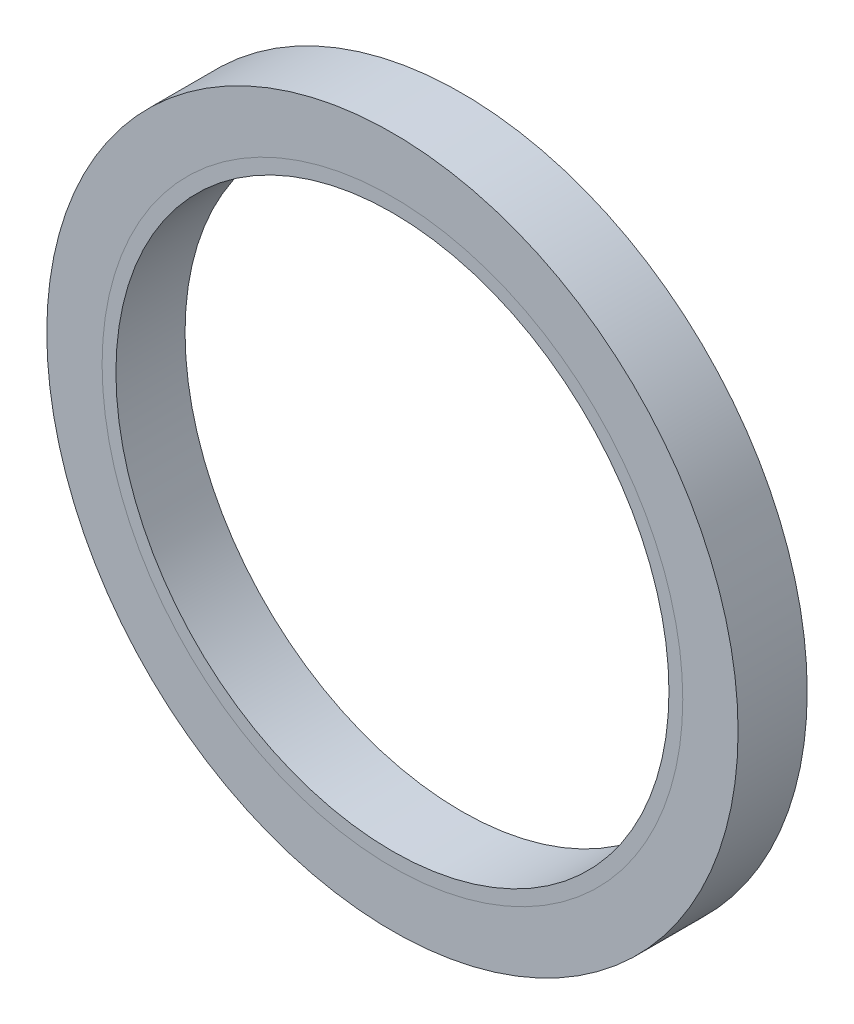
ISO-10303-21;
HEADER;
FILE_DESCRIPTION(('STEP AP214'),'2;1');
FILE_NAME('part.step','',(''),(''),'','','');
FILE_SCHEMA(('AUTOMOTIVE_DESIGN { 1 0 10303 214 1 1 1 1 }'));
ENDSEC;
DATA;
#1=APPLICATION_CONTEXT('core data for automotive mechanical design processes');
#2=APPLICATION_PROTOCOL_DEFINITION('international standard','automotive_design',2000,#1);
#3=PRODUCT_CONTEXT('',#1,'mechanical');
#4=PRODUCT('Part','Part','',(#3));
#5=PRODUCT_RELATED_PRODUCT_CATEGORY('part','',(#4));
#6=PRODUCT_DEFINITION_FORMATION('','',#4);
#7=PRODUCT_DEFINITION_CONTEXT('part definition',#1,'design');
#8=PRODUCT_DEFINITION('design','',#6,#7);
#9=PRODUCT_DEFINITION_SHAPE('','',#8);
#10=(LENGTH_UNIT() NAMED_UNIT(*) SI_UNIT(.MILLI.,.METRE.));
#11=(NAMED_UNIT(*) PLANE_ANGLE_UNIT() SI_UNIT($,.RADIAN.));
#12=(NAMED_UNIT(*) SI_UNIT($,.STERADIAN.) SOLID_ANGLE_UNIT());
#13=UNCERTAINTY_MEASURE_WITH_UNIT(LENGTH_MEASURE(1.E-05),#10,'distance_accuracy_value','');
#14=(GEOMETRIC_REPRESENTATION_CONTEXT(3) GLOBAL_UNCERTAINTY_ASSIGNED_CONTEXT((#13)) GLOBAL_UNIT_ASSIGNED_CONTEXT((#10,
#11,#12)) REPRESENTATION_CONTEXT('',''));
#15=CARTESIAN_POINT('',(0.,0.,0.));
#16=DIRECTION('',(0.,0.,1.));
#17=DIRECTION('',(1.,0.,0.));
#18=AXIS2_PLACEMENT_3D('',#15,#16,#17);
#19=CARTESIAN_POINT('',(0.,0.,10.));
#20=DIRECTION('',(0.,0.,1.));
#21=DIRECTION('',(1.,0.,0.));
#22=AXIS2_PLACEMENT_3D('',#19,#20,#21);
#23=PLANE('',#22);
#24=CARTESIAN_POINT('',(0.,0.,10.));
#25=DIRECTION('',(0.,0.,1.));
#26=DIRECTION('',(1.,0.,0.));
#27=AXIS2_PLACEMENT_3D('',#24,#25,#26);
#28=CIRCLE('',#27,50.);
#29=CARTESIAN_POINT('',(50.,0.,10.));
#30=VERTEX_POINT('',#29);
#31=EDGE_CURVE('E42',#30,#30,#28,.T.);
#32=ORIENTED_EDGE('',*,*,#31,.T.);
#33=EDGE_LOOP('',(#32));
#34=FACE_BOUND('',#33,.T.);
#35=CARTESIAN_POINT('',(0.,0.,10.));
#36=DIRECTION('',(0.,0.,1.));
#37=DIRECTION('',(1.,0.,0.));
#38=AXIS2_PLACEMENT_3D('',#35,#36,#37);
#39=CIRCLE('',#38,42.);
#40=CARTESIAN_POINT('',(42.,0.,10.));
#41=VERTEX_POINT('',#40);
#42=EDGE_CURVE('E10',#41,#41,#39,.F.);
#43=ORIENTED_EDGE('',*,*,#42,.T.);
#44=EDGE_LOOP('',(#43));
#45=FACE_BOUND('',#44,.T.);
#46=ADVANCED_FACE('F34',(#34,#45),#23,.T.);
#47=ORIENTED_EDGE('',*,*,#42,.F.);
#48=EDGE_LOOP('',(#47));
#49=FACE_BOUND('',#48,.T.);
#50=CARTESIAN_POINT('',(0.,0.,10.));
#51=DIRECTION('',(0.,0.,1.));
#52=DIRECTION('',(1.,0.,0.));
#53=AXIS2_PLACEMENT_3D('',#50,#51,#52);
#54=CIRCLE('',#53,40.);
#55=CARTESIAN_POINT('',(40.,0.,10.));
#56=VERTEX_POINT('',#55);
#57=EDGE_CURVE('E53',#56,#56,#54,.T.);
#58=ORIENTED_EDGE('',*,*,#57,.F.);
#59=EDGE_LOOP('',(#58));
#60=FACE_BOUND('',#59,.T.);
#61=ADVANCED_FACE('F64',(#49,#60),#23,.T.);
#62=CARTESIAN_POINT('',(0.,0.,0.));
#63=DIRECTION('',(0.,0.,1.));
#64=DIRECTION('',(1.,0.,0.));
#65=AXIS2_PLACEMENT_3D('',#62,#63,#64);
#66=PLANE('',#65);
#67=CARTESIAN_POINT('',(0.,0.,0.));
#68=DIRECTION('',(0.,0.,1.));
#69=DIRECTION('',(1.,0.,0.));
#70=AXIS2_PLACEMENT_3D('',#67,#68,#69);
#71=CIRCLE('',#70,50.);
#72=CARTESIAN_POINT('',(50.,0.,0.));
#73=VERTEX_POINT('',#72);
#74=EDGE_CURVE('E48',#73,#73,#71,.T.);
#75=ORIENTED_EDGE('',*,*,#74,.F.);
#76=EDGE_LOOP('',(#75));
#77=FACE_BOUND('',#76,.T.);
#78=CARTESIAN_POINT('',(0.,0.,0.));
#79=DIRECTION('',(0.,0.,1.));
#80=DIRECTION('',(1.,0.,0.));
#81=AXIS2_PLACEMENT_3D('',#78,#79,#80);
#82=CIRCLE('',#81,40.);
#83=CARTESIAN_POINT('',(40.,0.,0.));
#84=VERTEX_POINT('',#83);
#85=EDGE_CURVE('E55',#84,#84,#82,.T.);
#86=ORIENTED_EDGE('',*,*,#85,.T.);
#87=EDGE_LOOP('',(#86));
#88=FACE_BOUND('',#87,.T.);
#89=ADVANCED_FACE('F66',(#77,#88),#66,.F.);
#90=CARTESIAN_POINT('',(0.,0.,10.));
#91=DIRECTION('',(0.,0.,-1.));
#92=DIRECTION('',(-1.,0.,0.));
#93=AXIS2_PLACEMENT_3D('',#90,#91,#92);
#94=CYLINDRICAL_SURFACE('',#93,50.);
#95=ORIENTED_EDGE('',*,*,#31,.F.);
#96=EDGE_LOOP('',(#95));
#97=FACE_BOUND('',#96,.T.);
#98=ORIENTED_EDGE('',*,*,#74,.T.);
#99=EDGE_LOOP('',(#98));
#100=FACE_BOUND('',#99,.T.);
#101=ADVANCED_FACE('F36',(#97,#100),#94,.T.);
#102=CARTESIAN_POINT('',(0.,0.,10.));
#103=DIRECTION('',(0.,0.,-1.));
#104=DIRECTION('',(-1.,0.,0.));
#105=AXIS2_PLACEMENT_3D('',#102,#103,#104);
#106=CYLINDRICAL_SURFACE('',#105,40.);
#107=ORIENTED_EDGE('',*,*,#57,.T.);
#108=EDGE_LOOP('',(#107));
#109=FACE_BOUND('',#108,.T.);
#110=ORIENTED_EDGE('',*,*,#85,.F.);
#111=EDGE_LOOP('',(#110));
#112=FACE_BOUND('',#111,.T.);
#113=ADVANCED_FACE('F61',(#109,#112),#106,.F.);
#114=CLOSED_SHELL('',(#46,#61,#89,#101,#113));
#115=MANIFOLD_SOLID_BREP('B2',#114);
#116=ADVANCED_BREP_SHAPE_REPRESENTATION('',(#18,#115),#14);
#117=SHAPE_DEFINITION_REPRESENTATION(#9,#116);
ENDSEC;
END-ISO-10303-21;
